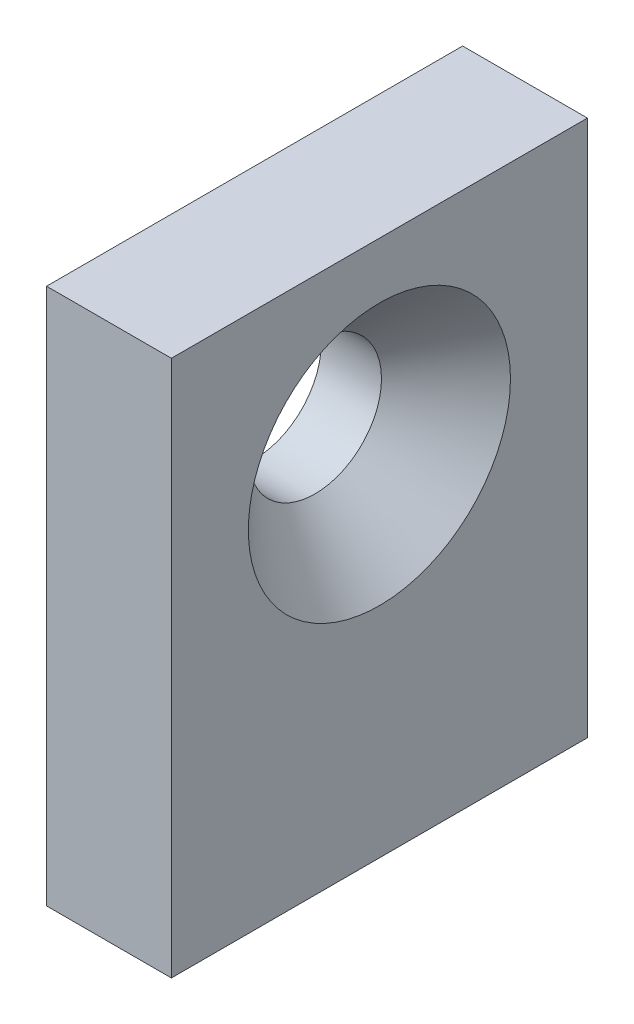
ISO-10303-21;
HEADER;
FILE_DESCRIPTION(('STEP AP214'),'2;1');
FILE_NAME('part.step','',(''),(''),'','','');
FILE_SCHEMA(('AUTOMOTIVE_DESIGN { 1 0 10303 214 1 1 1 1 }'));
ENDSEC;
DATA;
#1=APPLICATION_CONTEXT('core data for automotive mechanical design processes');
#2=APPLICATION_PROTOCOL_DEFINITION('international standard','automotive_design',2000,#1);
#3=PRODUCT_CONTEXT('',#1,'mechanical');
#4=PRODUCT('Part','Part','',(#3));
#5=PRODUCT_RELATED_PRODUCT_CATEGORY('part','',(#4));
#6=PRODUCT_DEFINITION_FORMATION('','',#4);
#7=PRODUCT_DEFINITION_CONTEXT('part definition',#1,'design');
#8=PRODUCT_DEFINITION('design','',#6,#7);
#9=PRODUCT_DEFINITION_SHAPE('','',#8);
#10=(LENGTH_UNIT() NAMED_UNIT(*) SI_UNIT(.MILLI.,.METRE.));
#11=(NAMED_UNIT(*) PLANE_ANGLE_UNIT() SI_UNIT($,.RADIAN.));
#12=(NAMED_UNIT(*) SI_UNIT($,.STERADIAN.) SOLID_ANGLE_UNIT());
#13=UNCERTAINTY_MEASURE_WITH_UNIT(LENGTH_MEASURE(1.E-05),#10,'distance_accuracy_value','');
#14=(GEOMETRIC_REPRESENTATION_CONTEXT(3) GLOBAL_UNCERTAINTY_ASSIGNED_CONTEXT((#13)) GLOBAL_UNIT_ASSIGNED_CONTEXT((#10,
#11,#12)) REPRESENTATION_CONTEXT('',''));
#15=CARTESIAN_POINT('',(0.,0.,0.));
#16=DIRECTION('',(0.,0.,1.));
#17=DIRECTION('',(1.,0.,0.));
#18=AXIS2_PLACEMENT_3D('',#15,#16,#17);
#19=CARTESIAN_POINT('',(0.,-4.6,-9.79999999999999));
#20=DIRECTION('',(0.,-1.,0.));
#21=DIRECTION('',(0.,0.,-1.));
#22=AXIS2_PLACEMENT_3D('',#19,#20,#21);
#23=PLANE('',#22);
#24=DIRECTION('',(0.,0.,1.));
#25=VECTOR('',#24,1.);
#26=CARTESIAN_POINT('',(27.3,-4.6,-9.79999999999999));
#27=LINE('',#26,#25);
#28=CARTESIAN_POINT('',(27.3,-4.6,17.8));
#29=VERTEX_POINT('',#28);
#30=CARTESIAN_POINT('',(27.3,-4.6,27.8));
#31=VERTEX_POINT('',#30);
#32=EDGE_CURVE('E11',#29,#31,#27,.T.);
#33=ORIENTED_EDGE('',*,*,#32,.F.);
#34=DIRECTION('',(-1.,0.,0.));
#35=VECTOR('',#34,1.);
#36=CARTESIAN_POINT('',(30.3,-4.6,17.8));
#37=LINE('',#36,#35);
#38=CARTESIAN_POINT('',(30.3,-4.6,17.8));
#39=VERTEX_POINT('',#38);
#40=EDGE_CURVE('E83',#39,#29,#37,.T.);
#41=ORIENTED_EDGE('',*,*,#40,.F.);
#42=DIRECTION('',(0.,0.,-1.));
#43=VECTOR('',#42,1.);
#44=CARTESIAN_POINT('',(30.3,-4.6,27.8));
#45=LINE('',#44,#43);
#46=CARTESIAN_POINT('',(30.3,-4.6,27.8));
#47=VERTEX_POINT('',#46);
#48=EDGE_CURVE('E111',#47,#39,#45,.T.);
#49=ORIENTED_EDGE('',*,*,#48,.F.);
#50=DIRECTION('',(-1.,0.,0.));
#51=VECTOR('',#50,1.);
#52=CARTESIAN_POINT('',(30.3,-4.6,27.8));
#53=LINE('',#52,#51);
#54=EDGE_CURVE('E91',#47,#31,#53,.T.);
#55=ORIENTED_EDGE('',*,*,#54,.T.);
#56=EDGE_LOOP('',(#33,#41,#49,#55));
#57=FACE_BOUND('',#56,.T.);
#58=ADVANCED_FACE('F33',(#57),#23,.T.);
#59=CARTESIAN_POINT('',(30.3,-4.6,27.8));
#60=DIRECTION('',(0.,0.,-1.));
#61=DIRECTION('',(0.,1.,0.));
#62=AXIS2_PLACEMENT_3D('',#59,#60,#61);
#63=PLANE('',#62);
#64=DIRECTION('',(0.,-1.,0.));
#65=VECTOR('',#64,1.);
#66=CARTESIAN_POINT('',(27.3,-4.6,27.8));
#67=LINE('',#66,#65);
#68=CARTESIAN_POINT('',(27.3,8.3,27.8));
#69=VERTEX_POINT('',#68);
#70=EDGE_CURVE('E36',#69,#31,#67,.T.);
#71=ORIENTED_EDGE('',*,*,#70,.T.);
#72=ORIENTED_EDGE('',*,*,#54,.F.);
#73=DIRECTION('',(0.,-1.,0.));
#74=VECTOR('',#73,1.);
#75=CARTESIAN_POINT('',(30.3,-4.6,27.8));
#76=LINE('',#75,#74);
#77=CARTESIAN_POINT('',(30.3,8.3,27.8));
#78=VERTEX_POINT('',#77);
#79=EDGE_CURVE('E87',#78,#47,#76,.T.);
#80=ORIENTED_EDGE('',*,*,#79,.F.);
#81=DIRECTION('',(-1.,0.,0.));
#82=VECTOR('',#81,1.);
#83=CARTESIAN_POINT('',(30.3,8.3,27.8));
#84=LINE('',#83,#82);
#85=EDGE_CURVE('E79',#78,#69,#84,.T.);
#86=ORIENTED_EDGE('',*,*,#85,.T.);
#87=EDGE_LOOP('',(#71,#72,#80,#86));
#88=FACE_BOUND('',#87,.T.);
#89=ADVANCED_FACE('F85',(#88),#63,.F.);
#90=CARTESIAN_POINT('',(30.3,-4.6,17.8));
#91=DIRECTION('',(0.,0.,1.));
#92=DIRECTION('',(1.,0.,0.));
#93=AXIS2_PLACEMENT_3D('',#90,#91,#92);
#94=PLANE('',#93);
#95=DIRECTION('',(0.,1.,0.));
#96=VECTOR('',#95,1.);
#97=CARTESIAN_POINT('',(27.3,-4.6,17.8));
#98=LINE('',#97,#96);
#99=CARTESIAN_POINT('',(27.3,8.3,17.8));
#100=VERTEX_POINT('',#99);
#101=EDGE_CURVE('E55',#29,#100,#98,.T.);
#102=ORIENTED_EDGE('',*,*,#101,.T.);
#103=DIRECTION('',(-1.,0.,0.));
#104=VECTOR('',#103,1.);
#105=CARTESIAN_POINT('',(30.3,8.3,17.8));
#106=LINE('',#105,#104);
#107=CARTESIAN_POINT('',(30.3,8.3,17.8));
#108=VERTEX_POINT('',#107);
#109=EDGE_CURVE('E82',#108,#100,#106,.T.);
#110=ORIENTED_EDGE('',*,*,#109,.F.);
#111=DIRECTION('',(0.,1.,0.));
#112=VECTOR('',#111,1.);
#113=CARTESIAN_POINT('',(30.3,-4.6,17.8));
#114=LINE('',#113,#112);
#115=EDGE_CURVE('E109',#39,#108,#114,.T.);
#116=ORIENTED_EDGE('',*,*,#115,.F.);
#117=ORIENTED_EDGE('',*,*,#40,.T.);
#118=EDGE_LOOP('',(#102,#110,#116,#117));
#119=FACE_BOUND('',#118,.T.);
#120=ADVANCED_FACE('F132',(#119),#94,.F.);
#121=CARTESIAN_POINT('',(30.3,8.3,27.8));
#122=DIRECTION('',(0.,-1.,0.));
#123=DIRECTION('',(0.,0.,-1.));
#124=AXIS2_PLACEMENT_3D('',#121,#122,#123);
#125=PLANE('',#124);
#126=DIRECTION('',(0.,0.,1.));
#127=VECTOR('',#126,1.);
#128=CARTESIAN_POINT('',(27.3,8.3,27.8));
#129=LINE('',#128,#127);
#130=EDGE_CURVE('E76',#100,#69,#129,.T.);
#131=ORIENTED_EDGE('',*,*,#130,.T.);
#132=ORIENTED_EDGE('',*,*,#85,.F.);
#133=DIRECTION('',(0.,0.,1.));
#134=VECTOR('',#133,1.);
#135=CARTESIAN_POINT('',(30.3,8.3,27.8));
#136=LINE('',#135,#134);
#137=EDGE_CURVE('E106',#108,#78,#136,.T.);
#138=ORIENTED_EDGE('',*,*,#137,.F.);
#139=ORIENTED_EDGE('',*,*,#109,.T.);
#140=EDGE_LOOP('',(#131,#132,#138,#139));
#141=FACE_BOUND('',#140,.T.);
#142=ADVANCED_FACE('F77',(#141),#125,.F.);
#143=CARTESIAN_POINT('',(30.3,8.3,27.8));
#144=DIRECTION('',(-1.,0.,0.));
#145=DIRECTION('',(0.,0.,1.));
#146=AXIS2_PLACEMENT_3D('',#143,#144,#145);
#147=PLANE('',#146);
#148=CARTESIAN_POINT('',(30.3,3.8,22.8));
#149=DIRECTION('',(1.,0.,0.));
#150=DIRECTION('',(0.,0.,-1.));
#151=AXIS2_PLACEMENT_3D('',#148,#149,#150);
#152=CIRCLE('',#151,3.15);
#153=CARTESIAN_POINT('',(30.3,3.8,19.65));
#154=VERTEX_POINT('',#153);
#155=EDGE_CURVE('E42',#154,#154,#152,.T.);
#156=ORIENTED_EDGE('',*,*,#155,.F.);
#157=EDGE_LOOP('',(#156));
#158=FACE_BOUND('',#157,.T.);
#159=ORIENTED_EDGE('',*,*,#79,.T.);
#160=ORIENTED_EDGE('',*,*,#48,.T.);
#161=ORIENTED_EDGE('',*,*,#115,.T.);
#162=ORIENTED_EDGE('',*,*,#137,.T.);
#163=EDGE_LOOP('',(#159,#160,#161,#162));
#164=FACE_BOUND('',#163,.T.);
#165=ADVANCED_FACE('F125',(#158,#164),#147,.F.);
#166=CARTESIAN_POINT('',(27.3,8.3,27.8));
#167=DIRECTION('',(-1.,0.,0.));
#168=DIRECTION('',(0.,0.,1.));
#169=AXIS2_PLACEMENT_3D('',#166,#167,#168);
#170=PLANE('',#169);
#171=CARTESIAN_POINT('',(27.3,3.8,22.8));
#172=DIRECTION('',(-1.,0.,0.));
#173=DIRECTION('',(0.,0.,1.));
#174=AXIS2_PLACEMENT_3D('',#171,#172,#173);
#175=CIRCLE('',#174,1.6);
#176=CARTESIAN_POINT('',(27.3,3.8,24.4));
#177=VERTEX_POINT('',#176);
#178=EDGE_CURVE('E114',#177,#177,#175,.T.);
#179=ORIENTED_EDGE('',*,*,#178,.F.);
#180=EDGE_LOOP('',(#179));
#181=FACE_BOUND('',#180,.T.);
#182=ORIENTED_EDGE('',*,*,#130,.F.);
#183=ORIENTED_EDGE('',*,*,#101,.F.);
#184=ORIENTED_EDGE('',*,*,#32,.T.);
#185=ORIENTED_EDGE('',*,*,#70,.F.);
#186=EDGE_LOOP('',(#182,#183,#184,#185));
#187=FACE_BOUND('',#186,.T.);
#188=ADVANCED_FACE('F89',(#181,#187),#170,.T.);
#189=CARTESIAN_POINT('',(30.3,3.8,22.8));
#190=DIRECTION('',(1.,0.,0.));
#191=DIRECTION('',(0.,0.,-1.));
#192=AXIS2_PLACEMENT_3D('',#189,#190,#191);
#193=CYLINDRICAL_SURFACE('',#192,1.6);
#194=CARTESIAN_POINT('',(28.75,3.8,22.8));
#195=DIRECTION('',(1.,0.,0.));
#196=DIRECTION('',(0.,0.,-1.));
#197=AXIS2_PLACEMENT_3D('',#194,#195,#196);
#198=CIRCLE('',#197,1.6);
#199=CARTESIAN_POINT('',(28.75,3.8,21.2));
#200=VERTEX_POINT('',#199);
#201=EDGE_CURVE('E108',#200,#200,#198,.T.);
#202=ORIENTED_EDGE('',*,*,#201,.T.);
#203=EDGE_LOOP('',(#202));
#204=FACE_BOUND('',#203,.T.);
#205=ORIENTED_EDGE('',*,*,#178,.T.);
#206=EDGE_LOOP('',(#205));
#207=FACE_BOUND('',#206,.T.);
#208=ADVANCED_FACE('F146',(#204,#207),#193,.F.);
#209=CARTESIAN_POINT('',(30.3,3.8,22.8));
#210=DIRECTION('',(1.,0.,0.));
#211=DIRECTION('',(0.,0.,-1.));
#212=AXIS2_PLACEMENT_3D('',#209,#210,#211);
#213=CONICAL_SURFACE('',#212,3.15,0.785398163397448);
#214=ORIENTED_EDGE('',*,*,#201,.F.);
#215=EDGE_LOOP('',(#214));
#216=FACE_BOUND('',#215,.T.);
#217=ORIENTED_EDGE('',*,*,#155,.T.);
#218=EDGE_LOOP('',(#217));
#219=FACE_BOUND('',#218,.T.);
#220=ADVANCED_FACE('F123',(#216,#219),#213,.F.);
#221=CLOSED_SHELL('',(#58,#89,#120,#142,#165,#188,#208,#220));
#222=MANIFOLD_SOLID_BREP('B2',#221);
#223=ADVANCED_BREP_SHAPE_REPRESENTATION('',(#18,#222),#14);
#224=SHAPE_DEFINITION_REPRESENTATION(#9,#223);
ENDSEC;
END-ISO-10303-21;
